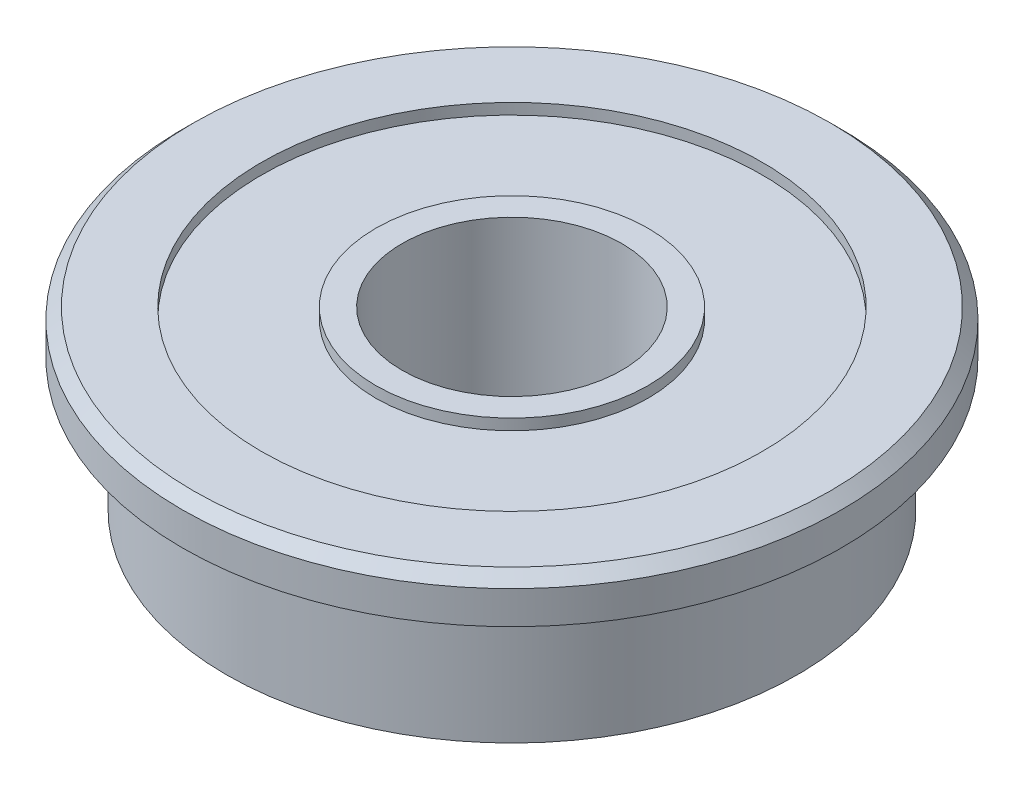
ISO-10303-21;
HEADER;
FILE_DESCRIPTION(('STEP AP214'),'2;1');
FILE_NAME('part.step','',(''),(''),'','','');
FILE_SCHEMA(('AUTOMOTIVE_DESIGN { 1 0 10303 214 1 1 1 1 }'));
ENDSEC;
DATA;
#1=APPLICATION_CONTEXT('core data for automotive mechanical design processes');
#2=APPLICATION_PROTOCOL_DEFINITION('international standard','automotive_design',2000,#1);
#3=PRODUCT_CONTEXT('',#1,'mechanical');
#4=PRODUCT('Part','Part','',(#3));
#5=PRODUCT_RELATED_PRODUCT_CATEGORY('part','',(#4));
#6=PRODUCT_DEFINITION_FORMATION('','',#4);
#7=PRODUCT_DEFINITION_CONTEXT('part definition',#1,'design');
#8=PRODUCT_DEFINITION('design','',#6,#7);
#9=PRODUCT_DEFINITION_SHAPE('','',#8);
#10=(LENGTH_UNIT() NAMED_UNIT(*) SI_UNIT(.MILLI.,.METRE.));
#11=(NAMED_UNIT(*) PLANE_ANGLE_UNIT() SI_UNIT($,.RADIAN.));
#12=(NAMED_UNIT(*) SI_UNIT($,.STERADIAN.) SOLID_ANGLE_UNIT());
#13=UNCERTAINTY_MEASURE_WITH_UNIT(LENGTH_MEASURE(1.E-05),#10,'distance_accuracy_value','');
#14=(GEOMETRIC_REPRESENTATION_CONTEXT(3) GLOBAL_UNCERTAINTY_ASSIGNED_CONTEXT((#13)) GLOBAL_UNIT_ASSIGNED_CONTEXT((#10,
#11,#12)) REPRESENTATION_CONTEXT('',''));
#15=CARTESIAN_POINT('',(0.,0.,0.));
#16=DIRECTION('',(0.,0.,1.));
#17=DIRECTION('',(1.,0.,0.));
#18=AXIS2_PLACEMENT_3D('',#15,#16,#17);
#19=CARTESIAN_POINT('',(0.,4.,0.));
#20=DIRECTION('',(0.,1.,0.));
#21=DIRECTION('',(0.,0.,1.));
#22=AXIS2_PLACEMENT_3D('',#19,#20,#21);
#23=PLANE('',#22);
#24=CARTESIAN_POINT('',(0.,4.,0.));
#25=DIRECTION('',(0.,1.,0.));
#26=DIRECTION('',(0.,0.,1.));
#27=AXIS2_PLACEMENT_3D('',#24,#25,#26);
#28=CIRCLE('',#27,2.5);
#29=CARTESIAN_POINT('',(0.,4.,2.5));
#30=VERTEX_POINT('',#29);
#31=EDGE_CURVE('E74',#30,#30,#28,.T.);
#32=ORIENTED_EDGE('',*,*,#31,.F.);
#33=EDGE_LOOP('',(#32));
#34=FACE_BOUND('',#33,.T.);
#35=CARTESIAN_POINT('',(0.,4.,0.));
#36=DIRECTION('',(0.,1.,0.));
#37=DIRECTION('',(0.,0.,1.));
#38=AXIS2_PLACEMENT_3D('',#35,#36,#37);
#39=CIRCLE('',#38,3.1);
#40=CARTESIAN_POINT('',(0.,4.,3.1));
#41=VERTEX_POINT('',#40);
#42=EDGE_CURVE('E96',#41,#41,#39,.T.);
#43=ORIENTED_EDGE('',*,*,#42,.T.);
#44=EDGE_LOOP('',(#43));
#45=FACE_BOUND('',#44,.T.);
#46=ADVANCED_FACE('F47',(#34,#45),#23,.T.);
#47=CARTESIAN_POINT('',(0.,0.,0.));
#48=DIRECTION('',(0.,1.,0.));
#49=DIRECTION('',(0.,0.,1.));
#50=AXIS2_PLACEMENT_3D('',#47,#48,#49);
#51=PLANE('',#50);
#52=CARTESIAN_POINT('',(0.,0.,0.));
#53=DIRECTION('',(0.,1.,0.));
#54=DIRECTION('',(0.,0.,1.));
#55=AXIS2_PLACEMENT_3D('',#52,#53,#54);
#56=CIRCLE('',#55,2.5);
#57=CARTESIAN_POINT('',(0.,0.,2.5));
#58=VERTEX_POINT('',#57);
#59=EDGE_CURVE('E67',#58,#58,#56,.T.);
#60=ORIENTED_EDGE('',*,*,#59,.T.);
#61=EDGE_LOOP('',(#60));
#62=FACE_BOUND('',#61,.T.);
#63=CARTESIAN_POINT('',(0.,0.,0.));
#64=DIRECTION('',(0.,-1.,0.));
#65=DIRECTION('',(0.,0.,-1.));
#66=AXIS2_PLACEMENT_3D('',#63,#64,#65);
#67=CIRCLE('',#66,3.1);
#68=CARTESIAN_POINT('',(0.,0.,-3.1));
#69=VERTEX_POINT('',#68);
#70=EDGE_CURVE('E84',#69,#69,#67,.T.);
#71=ORIENTED_EDGE('',*,*,#70,.T.);
#72=EDGE_LOOP('',(#71));
#73=FACE_BOUND('',#72,.T.);
#74=ADVANCED_FACE('F137',(#62,#73),#51,.F.);
#75=CARTESIAN_POINT('',(0.,0.,0.));
#76=DIRECTION('',(0.,-1.,0.));
#77=DIRECTION('',(0.,0.,-1.));
#78=AXIS2_PLACEMENT_3D('',#75,#76,#77);
#79=CIRCLE('',#78,5.7);
#80=CARTESIAN_POINT('',(0.,0.,-5.7));
#81=VERTEX_POINT('',#80);
#82=EDGE_CURVE('E78',#81,#81,#79,.T.);
#83=ORIENTED_EDGE('',*,*,#82,.F.);
#84=EDGE_LOOP('',(#83));
#85=FACE_BOUND('',#84,.T.);
#86=CARTESIAN_POINT('',(0.,0.,0.));
#87=DIRECTION('',(0.,1.,0.));
#88=DIRECTION('',(0.,0.,1.));
#89=AXIS2_PLACEMENT_3D('',#86,#87,#88);
#90=CIRCLE('',#89,6.5);
#91=CARTESIAN_POINT('',(0.,0.,6.5));
#92=VERTEX_POINT('',#91);
#93=EDGE_CURVE('E63',#92,#92,#90,.T.);
#94=ORIENTED_EDGE('',*,*,#93,.F.);
#95=EDGE_LOOP('',(#94));
#96=FACE_BOUND('',#95,.T.);
#97=ADVANCED_FACE('F143',(#85,#96),#51,.F.);
#98=CARTESIAN_POINT('',(0.,3.,0.));
#99=DIRECTION('',(0.,-1.,0.));
#100=DIRECTION('',(0.,0.,-1.));
#101=AXIS2_PLACEMENT_3D('',#98,#99,#100);
#102=CYLINDRICAL_SURFACE('',#101,6.5);
#103=CARTESIAN_POINT('',(0.,3.,0.));
#104=DIRECTION('',(0.,1.,0.));
#105=DIRECTION('',(0.,0.,1.));
#106=AXIS2_PLACEMENT_3D('',#103,#104,#105);
#107=CIRCLE('',#106,6.5);
#108=CARTESIAN_POINT('',(0.,3.,6.5));
#109=VERTEX_POINT('',#108);
#110=EDGE_CURVE('E59',#109,#109,#107,.T.);
#111=ORIENTED_EDGE('',*,*,#110,.F.);
#112=EDGE_LOOP('',(#111));
#113=FACE_BOUND('',#112,.T.);
#114=ORIENTED_EDGE('',*,*,#93,.T.);
#115=EDGE_LOOP('',(#114));
#116=FACE_BOUND('',#115,.T.);
#117=ADVANCED_FACE('F132',(#113,#116),#102,.T.);
#118=CARTESIAN_POINT('',(0.,3.,0.));
#119=DIRECTION('',(0.,-1.,0.));
#120=DIRECTION('',(0.,0.,-1.));
#121=AXIS2_PLACEMENT_3D('',#118,#119,#120);
#122=CYLINDRICAL_SURFACE('',#121,2.5);
#123=ORIENTED_EDGE('',*,*,#59,.F.);
#124=EDGE_LOOP('',(#123));
#125=FACE_BOUND('',#124,.T.);
#126=ORIENTED_EDGE('',*,*,#31,.T.);
#127=EDGE_LOOP('',(#126));
#128=FACE_BOUND('',#127,.T.);
#129=ADVANCED_FACE('F121',(#125,#128),#122,.F.);
#130=CARTESIAN_POINT('',(0.,4.,0.));
#131=DIRECTION('',(0.,1.,0.));
#132=DIRECTION('',(0.,0.,1.));
#133=AXIS2_PLACEMENT_3D('',#130,#131,#132);
#134=CIRCLE('',#133,7.25);
#135=CARTESIAN_POINT('',(0.,4.,7.25));
#136=VERTEX_POINT('',#135);
#137=EDGE_CURVE('E55',#136,#136,#134,.T.);
#138=ORIENTED_EDGE('',*,*,#137,.T.);
#139=EDGE_LOOP('',(#138));
#140=FACE_BOUND('',#139,.T.);
#141=CARTESIAN_POINT('',(0.,4.,0.));
#142=DIRECTION('',(0.,1.,0.));
#143=DIRECTION('',(0.,0.,1.));
#144=AXIS2_PLACEMENT_3D('',#141,#142,#143);
#145=CIRCLE('',#144,5.7);
#146=CARTESIAN_POINT('',(0.,4.,5.7));
#147=VERTEX_POINT('',#146);
#148=EDGE_CURVE('E90',#147,#147,#145,.T.);
#149=ORIENTED_EDGE('',*,*,#148,.F.);
#150=EDGE_LOOP('',(#149));
#151=FACE_BOUND('',#150,.T.);
#152=ADVANCED_FACE('F118',(#140,#151),#23,.T.);
#153=CARTESIAN_POINT('',(0.,3.,0.));
#154=DIRECTION('',(0.,1.,0.));
#155=DIRECTION('',(0.,0.,1.));
#156=AXIS2_PLACEMENT_3D('',#153,#154,#155);
#157=PLANE('',#156);
#158=ORIENTED_EDGE('',*,*,#110,.T.);
#159=EDGE_LOOP('',(#158));
#160=FACE_BOUND('',#159,.T.);
#161=CARTESIAN_POINT('',(0.,3.,0.));
#162=DIRECTION('',(0.,1.,0.));
#163=DIRECTION('',(0.,0.,1.));
#164=AXIS2_PLACEMENT_3D('',#161,#162,#163);
#165=CIRCLE('',#164,7.5);
#166=CARTESIAN_POINT('',(0.,3.,7.5));
#167=VERTEX_POINT('',#166);
#168=EDGE_CURVE('E71',#167,#167,#165,.T.);
#169=ORIENTED_EDGE('',*,*,#168,.F.);
#170=EDGE_LOOP('',(#169));
#171=FACE_BOUND('',#170,.T.);
#172=ADVANCED_FACE('F120',(#160,#171),#157,.F.);
#173=CARTESIAN_POINT('',(0.,4.,0.));
#174=DIRECTION('',(0.,-1.,0.));
#175=DIRECTION('',(0.,0.,-1.));
#176=AXIS2_PLACEMENT_3D('',#173,#174,#175);
#177=CYLINDRICAL_SURFACE('',#176,7.5);
#178=CARTESIAN_POINT('',(0.,3.75,0.));
#179=DIRECTION('',(0.,1.,0.));
#180=DIRECTION('',(0.,0.,1.));
#181=AXIS2_PLACEMENT_3D('',#178,#179,#180);
#182=CIRCLE('',#181,7.5);
#183=CARTESIAN_POINT('',(0.,3.75,7.5));
#184=VERTEX_POINT('',#183);
#185=EDGE_CURVE('E10',#184,#184,#182,.F.);
#186=ORIENTED_EDGE('',*,*,#185,.T.);
#187=EDGE_LOOP('',(#186));
#188=FACE_BOUND('',#187,.T.);
#189=ORIENTED_EDGE('',*,*,#168,.T.);
#190=EDGE_LOOP('',(#189));
#191=FACE_BOUND('',#190,.T.);
#192=ADVANCED_FACE('F128',(#188,#191),#177,.T.);
#193=CARTESIAN_POINT('',(0.,0.25,0.));
#194=DIRECTION('',(0.,-1.,0.));
#195=DIRECTION('',(0.,0.,-1.));
#196=AXIS2_PLACEMENT_3D('',#193,#194,#195);
#197=CYLINDRICAL_SURFACE('',#196,5.7);
#198=CARTESIAN_POINT('',(0.,0.25,0.));
#199=DIRECTION('',(0.,-1.,0.));
#200=DIRECTION('',(0.,0.,-1.));
#201=AXIS2_PLACEMENT_3D('',#198,#199,#200);
#202=CIRCLE('',#201,5.7);
#203=CARTESIAN_POINT('',(0.,0.25,-5.7));
#204=VERTEX_POINT('',#203);
#205=EDGE_CURVE('E77',#204,#204,#202,.T.);
#206=ORIENTED_EDGE('',*,*,#205,.F.);
#207=EDGE_LOOP('',(#206));
#208=FACE_BOUND('',#207,.T.);
#209=ORIENTED_EDGE('',*,*,#82,.T.);
#210=EDGE_LOOP('',(#209));
#211=FACE_BOUND('',#210,.T.);
#212=ADVANCED_FACE('F160',(#208,#211),#197,.F.);
#213=CARTESIAN_POINT('',(0.,0.25,0.));
#214=DIRECTION('',(0.,-1.,0.));
#215=DIRECTION('',(0.,0.,-1.));
#216=AXIS2_PLACEMENT_3D('',#213,#214,#215);
#217=PLANE('',#216);
#218=CARTESIAN_POINT('',(0.,0.25,0.));
#219=DIRECTION('',(0.,-1.,0.));
#220=DIRECTION('',(0.,0.,-1.));
#221=AXIS2_PLACEMENT_3D('',#218,#219,#220);
#222=CIRCLE('',#221,3.1);
#223=CARTESIAN_POINT('',(0.,0.25,-3.1));
#224=VERTEX_POINT('',#223);
#225=EDGE_CURVE('E81',#224,#224,#222,.T.);
#226=ORIENTED_EDGE('',*,*,#225,.F.);
#227=EDGE_LOOP('',(#226));
#228=FACE_BOUND('',#227,.T.);
#229=ORIENTED_EDGE('',*,*,#205,.T.);
#230=EDGE_LOOP('',(#229));
#231=FACE_BOUND('',#230,.T.);
#232=ADVANCED_FACE('F157',(#228,#231),#217,.T.);
#233=CARTESIAN_POINT('',(0.,0.25,0.));
#234=DIRECTION('',(0.,-1.,0.));
#235=DIRECTION('',(0.,0.,-1.));
#236=AXIS2_PLACEMENT_3D('',#233,#234,#235);
#237=CYLINDRICAL_SURFACE('',#236,3.1);
#238=ORIENTED_EDGE('',*,*,#225,.T.);
#239=EDGE_LOOP('',(#238));
#240=FACE_BOUND('',#239,.T.);
#241=ORIENTED_EDGE('',*,*,#70,.F.);
#242=EDGE_LOOP('',(#241));
#243=FACE_BOUND('',#242,.T.);
#244=ADVANCED_FACE('F114',(#240,#243),#237,.T.);
#245=CARTESIAN_POINT('',(0.,3.75,0.));
#246=DIRECTION('',(0.,1.,0.));
#247=DIRECTION('',(0.,0.,1.));
#248=AXIS2_PLACEMENT_3D('',#245,#246,#247);
#249=CYLINDRICAL_SURFACE('',#248,5.7);
#250=CARTESIAN_POINT('',(0.,3.75,0.));
#251=DIRECTION('',(0.,1.,0.));
#252=DIRECTION('',(0.,0.,1.));
#253=AXIS2_PLACEMENT_3D('',#250,#251,#252);
#254=CIRCLE('',#253,5.7);
#255=CARTESIAN_POINT('',(0.,3.75,5.7));
#256=VERTEX_POINT('',#255);
#257=EDGE_CURVE('E87',#256,#256,#254,.T.);
#258=ORIENTED_EDGE('',*,*,#257,.F.);
#259=EDGE_LOOP('',(#258));
#260=FACE_BOUND('',#259,.T.);
#261=ORIENTED_EDGE('',*,*,#148,.T.);
#262=EDGE_LOOP('',(#261));
#263=FACE_BOUND('',#262,.T.);
#264=ADVANCED_FACE('F108',(#260,#263),#249,.F.);
#265=CARTESIAN_POINT('',(0.,3.75,0.));
#266=DIRECTION('',(0.,1.,0.));
#267=DIRECTION('',(0.,0.,1.));
#268=AXIS2_PLACEMENT_3D('',#265,#266,#267);
#269=PLANE('',#268);
#270=CARTESIAN_POINT('',(0.,3.75,0.));
#271=DIRECTION('',(0.,1.,0.));
#272=DIRECTION('',(0.,0.,1.));
#273=AXIS2_PLACEMENT_3D('',#270,#271,#272);
#274=CIRCLE('',#273,3.1);
#275=CARTESIAN_POINT('',(0.,3.75,3.1));
#276=VERTEX_POINT('',#275);
#277=EDGE_CURVE('E93',#276,#276,#274,.T.);
#278=ORIENTED_EDGE('',*,*,#277,.F.);
#279=EDGE_LOOP('',(#278));
#280=FACE_BOUND('',#279,.T.);
#281=ORIENTED_EDGE('',*,*,#257,.T.);
#282=EDGE_LOOP('',(#281));
#283=FACE_BOUND('',#282,.T.);
#284=ADVANCED_FACE('F105',(#280,#283),#269,.T.);
#285=CARTESIAN_POINT('',(0.,3.75,0.));
#286=DIRECTION('',(0.,1.,0.));
#287=DIRECTION('',(0.,0.,1.));
#288=AXIS2_PLACEMENT_3D('',#285,#286,#287);
#289=CYLINDRICAL_SURFACE('',#288,3.1);
#290=ORIENTED_EDGE('',*,*,#277,.T.);
#291=EDGE_LOOP('',(#290));
#292=FACE_BOUND('',#291,.T.);
#293=ORIENTED_EDGE('',*,*,#42,.F.);
#294=EDGE_LOOP('',(#293));
#295=FACE_BOUND('',#294,.T.);
#296=ADVANCED_FACE('F102',(#292,#295),#289,.T.);
#297=CARTESIAN_POINT('',(0.,4.,0.));
#298=DIRECTION('',(0.,-1.,0.));
#299=DIRECTION('',(0.,0.,-1.));
#300=AXIS2_PLACEMENT_3D('',#297,#298,#299);
#301=CONICAL_SURFACE('',#300,7.25,0.78539816339745);
#302=ORIENTED_EDGE('',*,*,#185,.F.);
#303=EDGE_LOOP('',(#302));
#304=FACE_BOUND('',#303,.T.);
#305=ORIENTED_EDGE('',*,*,#137,.F.);
#306=EDGE_LOOP('',(#305));
#307=FACE_BOUND('',#306,.T.);
#308=ADVANCED_FACE('F50',(#304,#307),#301,.T.);
#309=CLOSED_SHELL('',(#46,#74,#97,#117,#129,#152,#172,#192,#212,#232,#244,#264,#284,#296,#308));
#310=MANIFOLD_SOLID_BREP('B2',#309);
#311=ADVANCED_BREP_SHAPE_REPRESENTATION('',(#18,#310),#14);
#312=SHAPE_DEFINITION_REPRESENTATION(#9,#311);
ENDSEC;
END-ISO-10303-21;
